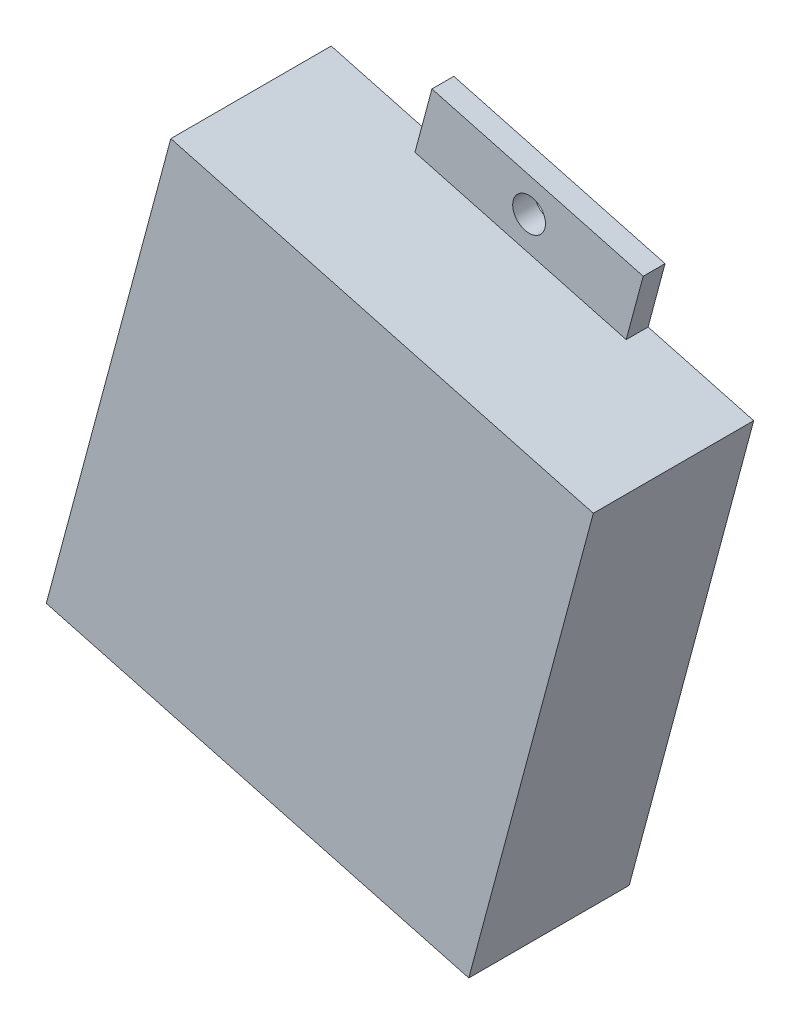
ISO-10303-21;
HEADER;
FILE_DESCRIPTION(('STEP AP214'),'2;1');
FILE_NAME('part.step','',(''),(''),'','','');
FILE_SCHEMA(('AUTOMOTIVE_DESIGN { 1 0 10303 214 1 1 1 1 }'));
ENDSEC;
DATA;
#1=APPLICATION_CONTEXT('core data for automotive mechanical design processes');
#2=APPLICATION_PROTOCOL_DEFINITION('international standard','automotive_design',2000,#1);
#3=PRODUCT_CONTEXT('',#1,'mechanical');
#4=PRODUCT('Part','Part','',(#3));
#5=PRODUCT_RELATED_PRODUCT_CATEGORY('part','',(#4));
#6=PRODUCT_DEFINITION_FORMATION('','',#4);
#7=PRODUCT_DEFINITION_CONTEXT('part definition',#1,'design');
#8=PRODUCT_DEFINITION('design','',#6,#7);
#9=PRODUCT_DEFINITION_SHAPE('','',#8);
#10=(LENGTH_UNIT() NAMED_UNIT(*) SI_UNIT(.MILLI.,.METRE.));
#11=(NAMED_UNIT(*) PLANE_ANGLE_UNIT() SI_UNIT($,.RADIAN.));
#12=(NAMED_UNIT(*) SI_UNIT($,.STERADIAN.) SOLID_ANGLE_UNIT());
#13=UNCERTAINTY_MEASURE_WITH_UNIT(LENGTH_MEASURE(1.E-05),#10,'distance_accuracy_value','');
#14=(GEOMETRIC_REPRESENTATION_CONTEXT(3) GLOBAL_UNCERTAINTY_ASSIGNED_CONTEXT((#13)) GLOBAL_UNIT_ASSIGNED_CONTEXT((#10,
#11,#12)) REPRESENTATION_CONTEXT('',''));
#15=CARTESIAN_POINT('',(0.,0.,0.));
#16=DIRECTION('',(0.,0.,1.));
#17=DIRECTION('',(1.,0.,0.));
#18=AXIS2_PLACEMENT_3D('',#15,#16,#17);
#19=CARTESIAN_POINT('',(31.705714191345,-147.7777815141,107.3));
#20=DIRECTION('',(0.,0.,1.));
#21=DIRECTION('',(0.258819045102985,0.965925826288944,0.));
#22=AXIS2_PLACEMENT_3D('',#19,#20,#21);
#23=CYLINDRICAL_SURFACE('',#22,2.25);
#24=DIRECTION('',(0.,0.,1.));
#25=VECTOR('',#24,1.);
#26=CARTESIAN_POINT('',(32.288057042825,-145.604448405,107.3));
#27=LINE('',#26,#25);
#28=CARTESIAN_POINT('',(32.288057042825,-145.604448405,107.5));
#29=VERTEX_POINT('',#28);
#30=CARTESIAN_POINT('',(32.288057042825,-145.604448405,110.5));
#31=VERTEX_POINT('',#30);
#32=EDGE_CURVE('E10',#29,#31,#27,.T.);
#33=ORIENTED_EDGE('',*,*,#32,.F.);
#34=CARTESIAN_POINT('',(31.705714191345,-147.7777815141,107.5));
#35=DIRECTION('',(0.,0.,1.));
#36=DIRECTION('',(0.258819045102985,0.965925826288944,0.));
#37=AXIS2_PLACEMENT_3D('',#34,#35,#36);
#38=CIRCLE('',#37,2.25);
#39=EDGE_CURVE('E167',#29,#29,#38,.T.);
#40=ORIENTED_EDGE('',*,*,#39,.F.);
#41=ORIENTED_EDGE('',*,*,#32,.T.);
#42=CARTESIAN_POINT('',(31.705714191345,-147.7777815141,110.5));
#43=DIRECTION('',(0.,0.,1.));
#44=DIRECTION('',(0.258819045102985,0.965925826288944,0.));
#45=AXIS2_PLACEMENT_3D('',#42,#43,#44);
#46=CIRCLE('',#45,2.25);
#47=EDGE_CURVE('E208',#31,#31,#46,.T.);
#48=ORIENTED_EDGE('',*,*,#47,.T.);
#49=EDGE_LOOP('',(#33,#40,#41,#48));
#50=FACE_BOUND('',#49,.T.);
#51=ADVANCED_FACE('F15',(#50),#23,.F.);
#52=CARTESIAN_POINT('',(47.359287288642,-147.3134009723,107.5));
#53=DIRECTION('',(0.258819045102985,0.965925826288944,0.));
#54=DIRECTION('',(0.,0.,-1.));
#55=AXIS2_PLACEMENT_3D('',#52,#53,#54);
#56=PLANE('',#55);
#57=DIRECTION('',(0.,0.,1.));
#58=VECTOR('',#57,1.);
#59=CARTESIAN_POINT('',(47.359287288642,-147.3134009723,107.5));
#60=LINE('',#59,#58);
#61=CARTESIAN_POINT('',(47.359287288642,-147.3134009723,107.5));
#62=VERTEX_POINT('',#61);
#63=CARTESIAN_POINT('',(47.359287288642,-147.3134009723,110.5));
#64=VERTEX_POINT('',#63);
#65=EDGE_CURVE('E26',#62,#64,#60,.T.);
#66=ORIENTED_EDGE('',*,*,#65,.F.);
#67=DIRECTION('',(-0.965925826288944,0.258819045102985,0.));
#68=VECTOR('',#67,1.);
#69=CARTESIAN_POINT('',(47.359287288642,-147.3134009723,107.5));
#70=LINE('',#69,#68);
#71=CARTESIAN_POINT('',(18.38151249997,-139.5488296193,107.5));
#72=VERTEX_POINT('',#71);
#73=EDGE_CURVE('E218',#62,#72,#70,.T.);
#74=ORIENTED_EDGE('',*,*,#73,.T.);
#75=DIRECTION('',(0.,0.,1.));
#76=VECTOR('',#75,1.);
#77=CARTESIAN_POINT('',(18.38151249997,-139.5488296193,107.5));
#78=LINE('',#77,#76);
#79=CARTESIAN_POINT('',(18.38151249997,-139.5488296193,110.5));
#80=VERTEX_POINT('',#79);
#81=EDGE_CURVE('E254',#72,#80,#78,.T.);
#82=ORIENTED_EDGE('',*,*,#81,.T.);
#83=DIRECTION('',(-0.965925826288944,0.258819045102985,0.));
#84=VECTOR('',#83,1.);
#85=CARTESIAN_POINT('',(47.359287288642,-147.3134009723,110.5));
#86=LINE('',#85,#84);
#87=EDGE_CURVE('E205',#64,#80,#86,.T.);
#88=ORIENTED_EDGE('',*,*,#87,.F.);
#89=EDGE_LOOP('',(#66,#74,#82,#88));
#90=FACE_BOUND('',#89,.T.);
#91=ADVANCED_FACE('F320',(#90),#56,.T.);
#92=CARTESIAN_POINT('',(45.029915882719,-156.0067334089,107.5));
#93=DIRECTION('',(-0.965925826288944,0.258819045102985,0.));
#94=DIRECTION('',(0.,0.,1.));
#95=AXIS2_PLACEMENT_3D('',#92,#93,#94);
#96=PLANE('',#95);
#97=ORIENTED_EDGE('',*,*,#65,.T.);
#98=DIRECTION('',(0.258819045102985,0.965925826288944,0.));
#99=VECTOR('',#98,1.);
#100=CARTESIAN_POINT('',(45.029915882719,-156.0067334089,110.5));
#101=LINE('',#100,#99);
#102=CARTESIAN_POINT('',(45.029915882719,-156.0067334089,110.5));
#103=VERTEX_POINT('',#102);
#104=EDGE_CURVE('E209',#103,#64,#101,.T.);
#105=ORIENTED_EDGE('',*,*,#104,.F.);
#106=DIRECTION('',(0.,0.,1.));
#107=VECTOR('',#106,1.);
#108=CARTESIAN_POINT('',(45.029915882719,-156.0067334089,107.5));
#109=LINE('',#108,#107);
#110=CARTESIAN_POINT('',(45.029915882719,-156.0067334089,107.5));
#111=VERTEX_POINT('',#110);
#112=EDGE_CURVE('E223',#111,#103,#109,.T.);
#113=ORIENTED_EDGE('',*,*,#112,.F.);
#114=DIRECTION('',(0.258819045102985,0.965925826288944,0.));
#115=VECTOR('',#114,1.);
#116=CARTESIAN_POINT('',(45.029915882719,-156.0067334089,107.5));
#117=LINE('',#116,#115);
#118=EDGE_CURVE('E181',#111,#62,#117,.T.);
#119=ORIENTED_EDGE('',*,*,#118,.T.);
#120=EDGE_LOOP('',(#97,#105,#113,#119));
#121=FACE_BOUND('',#120,.T.);
#122=ADVANCED_FACE('F328',(#121),#96,.F.);
#123=CARTESIAN_POINT('',(45.029915882719,-156.0067334089,110.5));
#124=DIRECTION('',(0.,0.,1.));
#125=DIRECTION('',(1.,0.,0.));
#126=AXIS2_PLACEMENT_3D('',#123,#124,#125);
#127=PLANE('',#126);
#128=ORIENTED_EDGE('',*,*,#47,.F.);
#129=EDGE_LOOP('',(#128));
#130=FACE_BOUND('',#129,.T.);
#131=DIRECTION('',(-0.965925826288944,0.258819045102985,0.));
#132=VECTOR('',#131,1.);
#133=CARTESIAN_POINT('',(45.029915882719,-156.0067334089,110.5));
#134=LINE('',#133,#132);
#135=CARTESIAN_POINT('',(16.052141094047,-148.2421620559,110.5));
#136=VERTEX_POINT('',#135);
#137=EDGE_CURVE('E201',#103,#136,#134,.T.);
#138=ORIENTED_EDGE('',*,*,#137,.F.);
#139=ORIENTED_EDGE('',*,*,#104,.T.);
#140=ORIENTED_EDGE('',*,*,#87,.T.);
#141=DIRECTION('',(0.258819045102985,0.965925826288944,0.));
#142=VECTOR('',#141,1.);
#143=CARTESIAN_POINT('',(16.052141094047,-148.2421620559,110.5));
#144=LINE('',#143,#142);
#145=EDGE_CURVE('E161',#136,#80,#144,.T.);
#146=ORIENTED_EDGE('',*,*,#145,.F.);
#147=EDGE_LOOP('',(#138,#139,#140,#146));
#148=FACE_BOUND('',#147,.T.);
#149=ADVANCED_FACE('F17',(#130,#148),#127,.T.);
#150=CARTESIAN_POINT('',(16.052141094047,-148.2421620559,107.5));
#151=DIRECTION('',(-0.965925826288944,0.258819045102985,0.));
#152=DIRECTION('',(0.,0.,1.));
#153=AXIS2_PLACEMENT_3D('',#150,#151,#152);
#154=PLANE('',#153);
#155=DIRECTION('',(0.258819045102985,0.965925826288944,0.));
#156=VECTOR('',#155,1.);
#157=CARTESIAN_POINT('',(16.052141094047,-148.2421620559,107.5));
#158=LINE('',#157,#156);
#159=CARTESIAN_POINT('',(16.052141094047,-148.2421620559,107.5));
#160=VERTEX_POINT('',#159);
#161=EDGE_CURVE('E214',#160,#72,#158,.T.);
#162=ORIENTED_EDGE('',*,*,#161,.F.);
#163=DIRECTION('',(0.,0.,1.));
#164=VECTOR('',#163,1.);
#165=CARTESIAN_POINT('',(16.052141094047,-148.2421620559,107.5));
#166=LINE('',#165,#164);
#167=EDGE_CURVE('E162',#160,#136,#166,.T.);
#168=ORIENTED_EDGE('',*,*,#167,.T.);
#169=ORIENTED_EDGE('',*,*,#145,.T.);
#170=ORIENTED_EDGE('',*,*,#81,.F.);
#171=EDGE_LOOP('',(#162,#168,#169,#170));
#172=FACE_BOUND('',#171,.T.);
#173=ADVANCED_FACE('F324',(#172),#154,.T.);
#174=CARTESIAN_POINT('',(12.294285808655,-220.2222184858,107.3));
#175=DIRECTION('',(0.,0.,1.));
#176=DIRECTION('',(0.258819045102985,0.965925826288944,0.));
#177=AXIS2_PLACEMENT_3D('',#174,#175,#176);
#178=CYLINDRICAL_SURFACE('',#177,2.25);
#179=DIRECTION('',(0.,0.,1.));
#180=VECTOR('',#179,1.);
#181=CARTESIAN_POINT('',(12.876628660136,-218.0488853766,107.3));
#182=LINE('',#181,#180);
#183=CARTESIAN_POINT('',(12.876628660136,-218.0488853766,107.5));
#184=VERTEX_POINT('',#183);
#185=CARTESIAN_POINT('',(12.876628660136,-218.0488853766,110.5));
#186=VERTEX_POINT('',#185);
#187=EDGE_CURVE('E154',#184,#186,#182,.T.);
#188=ORIENTED_EDGE('',*,*,#187,.F.);
#189=CARTESIAN_POINT('',(12.294285808655,-220.2222184858,107.5));
#190=DIRECTION('',(0.,0.,1.));
#191=DIRECTION('',(0.258819045102985,0.965925826288944,0.));
#192=AXIS2_PLACEMENT_3D('',#189,#190,#191);
#193=CIRCLE('',#192,2.25);
#194=EDGE_CURVE('E157',#184,#184,#193,.T.);
#195=ORIENTED_EDGE('',*,*,#194,.F.);
#196=ORIENTED_EDGE('',*,*,#187,.T.);
#197=CARTESIAN_POINT('',(12.294285808655,-220.2222184858,110.5));
#198=DIRECTION('',(0.,0.,1.));
#199=DIRECTION('',(0.258819045102985,0.965925826288944,0.));
#200=AXIS2_PLACEMENT_3D('',#197,#198,#199);
#201=CIRCLE('',#200,2.25);
#202=EDGE_CURVE('E159',#186,#186,#201,.T.);
#203=ORIENTED_EDGE('',*,*,#202,.T.);
#204=EDGE_LOOP('',(#188,#195,#196,#203));
#205=FACE_BOUND('',#204,.T.);
#206=ADVANCED_FACE('F156',(#205),#178,.F.);
#207=CARTESIAN_POINT('',(25.61848750003,-228.4511703806,107.5));
#208=DIRECTION('',(0.258819045102985,0.965925826288944,0.));
#209=DIRECTION('',(0.,0.,-1.));
#210=AXIS2_PLACEMENT_3D('',#207,#208,#209);
#211=PLANE('',#210);
#212=DIRECTION('',(-0.965925826288944,0.258819045102985,0.));
#213=VECTOR('',#212,1.);
#214=CARTESIAN_POINT('',(25.61848750003,-228.4511703806,110.5));
#215=LINE('',#214,#213);
#216=CARTESIAN_POINT('',(25.61848750003,-228.4511703806,110.5));
#217=VERTEX_POINT('',#216);
#218=CARTESIAN_POINT('',(-3.359287288642,-220.6865990276,110.5));
#219=VERTEX_POINT('',#218);
#220=EDGE_CURVE('E204',#217,#219,#215,.T.);
#221=ORIENTED_EDGE('',*,*,#220,.T.);
#222=DIRECTION('',(0.,0.,1.));
#223=VECTOR('',#222,1.);
#224=CARTESIAN_POINT('',(-3.359287288642,-220.6865990276,107.5));
#225=LINE('',#224,#223);
#226=CARTESIAN_POINT('',(-3.359287288642,-220.6865990276,107.5));
#227=VERTEX_POINT('',#226);
#228=EDGE_CURVE('E174',#227,#219,#225,.T.);
#229=ORIENTED_EDGE('',*,*,#228,.F.);
#230=DIRECTION('',(-0.965925826288944,0.258819045102985,0.));
#231=VECTOR('',#230,1.);
#232=CARTESIAN_POINT('',(25.61848750003,-228.4511703806,107.5));
#233=LINE('',#232,#231);
#234=CARTESIAN_POINT('',(25.61848750003,-228.4511703806,107.5));
#235=VERTEX_POINT('',#234);
#236=EDGE_CURVE('E278',#235,#227,#233,.T.);
#237=ORIENTED_EDGE('',*,*,#236,.F.);
#238=DIRECTION('',(0.,0.,1.));
#239=VECTOR('',#238,1.);
#240=CARTESIAN_POINT('',(25.61848750003,-228.4511703806,107.5));
#241=LINE('',#240,#239);
#242=EDGE_CURVE('E196',#235,#217,#241,.T.);
#243=ORIENTED_EDGE('',*,*,#242,.T.);
#244=EDGE_LOOP('',(#221,#229,#237,#243));
#245=FACE_BOUND('',#244,.T.);
#246=ADVANCED_FACE('F302',(#245),#211,.F.);
#247=CARTESIAN_POINT('',(59.518803277055,-159.8890190855,107.5));
#248=DIRECTION('',(0.258819045102985,0.965925826288944,0.));
#249=DIRECTION('',(0.,0.,-1.));
#250=AXIS2_PLACEMENT_3D('',#247,#248,#249);
#251=PLANE('',#250);
#252=DIRECTION('',(-0.965925826288944,0.258819045102985,0.));
#253=VECTOR('',#252,1.);
#254=CARTESIAN_POINT('',(59.518803277055,-159.8890190855,129.5));
#255=LINE('',#254,#253);
#256=CARTESIAN_POINT('',(59.518803277055,-159.8890190855,129.5));
#257=VERTEX_POINT('',#256);
#258=CARTESIAN_POINT('',(1.563253699711,-144.3598763793,129.5));
#259=VERTEX_POINT('',#258);
#260=EDGE_CURVE('E187',#257,#259,#255,.T.);
#261=ORIENTED_EDGE('',*,*,#260,.F.);
#262=DIRECTION('',(0.,0.,1.));
#263=VECTOR('',#262,1.);
#264=CARTESIAN_POINT('',(59.518803277055,-159.8890190855,107.5));
#265=LINE('',#264,#263);
#266=CARTESIAN_POINT('',(59.518803277055,-159.8890190855,107.5));
#267=VERTEX_POINT('',#266);
#268=EDGE_CURVE('E227',#267,#257,#265,.T.);
#269=ORIENTED_EDGE('',*,*,#268,.F.);
#270=DIRECTION('',(-0.965925826288944,0.258819045102985,0.));
#271=VECTOR('',#270,1.);
#272=CARTESIAN_POINT('',(59.518803277055,-159.8890190855,107.5));
#273=LINE('',#272,#271);
#274=EDGE_CURVE('E177',#267,#111,#273,.T.);
#275=ORIENTED_EDGE('',*,*,#274,.T.);
#276=ORIENTED_EDGE('',*,*,#112,.T.);
#277=ORIENTED_EDGE('',*,*,#137,.T.);
#278=ORIENTED_EDGE('',*,*,#167,.F.);
#279=DIRECTION('',(-0.965925826288944,0.258819045102985,0.));
#280=VECTOR('',#279,1.);
#281=CARTESIAN_POINT('',(59.518803277055,-159.8890190855,107.5));
#282=LINE('',#281,#280);
#283=CARTESIAN_POINT('',(1.563253699711,-144.3598763793,107.5));
#284=VERTEX_POINT('',#283);
#285=EDGE_CURVE('E219',#160,#284,#282,.T.);
#286=ORIENTED_EDGE('',*,*,#285,.T.);
#287=DIRECTION('',(0.,0.,1.));
#288=VECTOR('',#287,1.);
#289=CARTESIAN_POINT('',(1.563253699711,-144.3598763793,107.5));
#290=LINE('',#289,#288);
#291=EDGE_CURVE('E19',#284,#259,#290,.T.);
#292=ORIENTED_EDGE('',*,*,#291,.T.);
#293=EDGE_LOOP('',(#261,#269,#275,#276,#277,#278,#286,#292));
#294=FACE_BOUND('',#293,.T.);
#295=ADVANCED_FACE('F335',(#294),#251,.T.);
#296=CARTESIAN_POINT('',(42.436746300289,-223.6401236206,107.5));
#297=DIRECTION('',(-0.965925826288944,0.258819045102985,0.));
#298=DIRECTION('',(0.,0.,1.));
#299=AXIS2_PLACEMENT_3D('',#296,#297,#298);
#300=PLANE('',#299);
#301=ORIENTED_EDGE('',*,*,#268,.T.);
#302=DIRECTION('',(0.258819045102985,0.965925826288944,0.));
#303=VECTOR('',#302,1.);
#304=CARTESIAN_POINT('',(42.436746300289,-223.6401236206,129.5));
#305=LINE('',#304,#303);
#306=CARTESIAN_POINT('',(42.436746300289,-223.6401236206,129.5));
#307=VERTEX_POINT('',#306);
#308=EDGE_CURVE('E80',#307,#257,#305,.T.);
#309=ORIENTED_EDGE('',*,*,#308,.F.);
#310=DIRECTION('',(0.,0.,1.));
#311=VECTOR('',#310,1.);
#312=CARTESIAN_POINT('',(42.436746300289,-223.6401236206,107.5));
#313=LINE('',#312,#311);
#314=CARTESIAN_POINT('',(42.436746300289,-223.6401236206,107.5));
#315=VERTEX_POINT('',#314);
#316=EDGE_CURVE('E264',#315,#307,#313,.T.);
#317=ORIENTED_EDGE('',*,*,#316,.F.);
#318=DIRECTION('',(0.258819045102985,0.965925826288944,0.));
#319=VECTOR('',#318,1.);
#320=CARTESIAN_POINT('',(42.436746300289,-223.6401236206,107.5));
#321=LINE('',#320,#319);
#322=EDGE_CURVE('E91',#315,#267,#321,.T.);
#323=ORIENTED_EDGE('',*,*,#322,.T.);
#324=EDGE_LOOP('',(#301,#309,#317,#323));
#325=FACE_BOUND('',#324,.T.);
#326=ADVANCED_FACE('F372',(#325),#300,.F.);
#327=CARTESIAN_POINT('',(25.61848750003,-228.4511703806,107.5));
#328=DIRECTION('',(-0.965925826288944,0.258819045102985,0.));
#329=DIRECTION('',(0.,0.,1.));
#330=AXIS2_PLACEMENT_3D('',#327,#328,#329);
#331=PLANE('',#330);
#332=DIRECTION('',(0.,0.,1.));
#333=VECTOR('',#332,1.);
#334=CARTESIAN_POINT('',(27.947858905953,-219.757837944,107.5));
#335=LINE('',#334,#333);
#336=CARTESIAN_POINT('',(27.947858905953,-219.757837944,107.5));
#337=VERTEX_POINT('',#336);
#338=CARTESIAN_POINT('',(27.947858905953,-219.757837944,110.5));
#339=VERTEX_POINT('',#338);
#340=EDGE_CURVE('E233',#337,#339,#335,.T.);
#341=ORIENTED_EDGE('',*,*,#340,.T.);
#342=DIRECTION('',(0.258819045102985,0.965925826288944,0.));
#343=VECTOR('',#342,1.);
#344=CARTESIAN_POINT('',(25.61848750003,-228.4511703806,110.5));
#345=LINE('',#344,#343);
#346=EDGE_CURVE('E197',#217,#339,#345,.T.);
#347=ORIENTED_EDGE('',*,*,#346,.F.);
#348=ORIENTED_EDGE('',*,*,#242,.F.);
#349=DIRECTION('',(0.258819045102985,0.965925826288944,0.));
#350=VECTOR('',#349,1.);
#351=CARTESIAN_POINT('',(25.61848750003,-228.4511703806,107.5));
#352=LINE('',#351,#350);
#353=EDGE_CURVE('E276',#235,#337,#352,.T.);
#354=ORIENTED_EDGE('',*,*,#353,.T.);
#355=EDGE_LOOP('',(#341,#347,#348,#354));
#356=FACE_BOUND('',#355,.T.);
#357=ADVANCED_FACE('F297',(#356),#331,.F.);
#358=CARTESIAN_POINT('',(25.61848750003,-228.4511703806,110.5));
#359=DIRECTION('',(0.,0.,1.));
#360=DIRECTION('',(1.,0.,0.));
#361=AXIS2_PLACEMENT_3D('',#358,#359,#360);
#362=PLANE('',#361);
#363=ORIENTED_EDGE('',*,*,#202,.F.);
#364=EDGE_LOOP('',(#363));
#365=FACE_BOUND('',#364,.T.);
#366=ORIENTED_EDGE('',*,*,#220,.F.);
#367=ORIENTED_EDGE('',*,*,#346,.T.);
#368=DIRECTION('',(-0.965925826288944,0.258819045102985,0.));
#369=VECTOR('',#368,1.);
#370=CARTESIAN_POINT('',(27.947858905953,-219.757837944,110.5));
#371=LINE('',#370,#369);
#372=CARTESIAN_POINT('',(-1.029915882719,-211.993266591,110.5));
#373=VERTEX_POINT('',#372);
#374=EDGE_CURVE('E238',#339,#373,#371,.T.);
#375=ORIENTED_EDGE('',*,*,#374,.T.);
#376=DIRECTION('',(0.258819045102985,0.965925826288944,0.));
#377=VECTOR('',#376,1.);
#378=CARTESIAN_POINT('',(-3.359287288642,-220.6865990276,110.5));
#379=LINE('',#378,#377);
#380=EDGE_CURVE('E222',#219,#373,#379,.T.);
#381=ORIENTED_EDGE('',*,*,#380,.F.);
#382=EDGE_LOOP('',(#366,#367,#375,#381));
#383=FACE_BOUND('',#382,.T.);
#384=ADVANCED_FACE('F371',(#365,#383),#362,.T.);
#385=CARTESIAN_POINT('',(-3.359287288642,-220.6865990276,107.5));
#386=DIRECTION('',(-0.965925826288944,0.258819045102985,0.));
#387=DIRECTION('',(0.,0.,1.));
#388=AXIS2_PLACEMENT_3D('',#385,#386,#387);
#389=PLANE('',#388);
#390=DIRECTION('',(0.258819045102985,0.965925826288944,0.));
#391=VECTOR('',#390,1.);
#392=CARTESIAN_POINT('',(-3.359287288642,-220.6865990276,107.5));
#393=LINE('',#392,#391);
#394=CARTESIAN_POINT('',(-1.029915882719,-211.993266591,107.5));
#395=VERTEX_POINT('',#394);
#396=EDGE_CURVE('E270',#227,#395,#393,.T.);
#397=ORIENTED_EDGE('',*,*,#396,.F.);
#398=ORIENTED_EDGE('',*,*,#228,.T.);
#399=ORIENTED_EDGE('',*,*,#380,.T.);
#400=DIRECTION('',(0.,0.,1.));
#401=VECTOR('',#400,1.);
#402=CARTESIAN_POINT('',(-1.029915882719,-211.993266591,107.5));
#403=LINE('',#402,#401);
#404=EDGE_CURVE('E191',#395,#373,#403,.T.);
#405=ORIENTED_EDGE('',*,*,#404,.F.);
#406=EDGE_LOOP('',(#397,#398,#399,#405));
#407=FACE_BOUND('',#406,.T.);
#408=ADVANCED_FACE('F394',(#407),#389,.T.);
#409=CARTESIAN_POINT('',(42.436746300289,-223.6401236206,107.5));
#410=DIRECTION('',(0.,0.,1.));
#411=DIRECTION('',(1.,0.,0.));
#412=AXIS2_PLACEMENT_3D('',#409,#410,#411);
#413=PLANE('',#412);
#414=ORIENTED_EDGE('',*,*,#39,.T.);
#415=EDGE_LOOP('',(#414));
#416=FACE_BOUND('',#415,.T.);
#417=ORIENTED_EDGE('',*,*,#194,.T.);
#418=EDGE_LOOP('',(#417));
#419=FACE_BOUND('',#418,.T.);
#420=ORIENTED_EDGE('',*,*,#353,.F.);
#421=ORIENTED_EDGE('',*,*,#236,.T.);
#422=ORIENTED_EDGE('',*,*,#396,.T.);
#423=DIRECTION('',(-0.965925826288944,0.258819045102985,0.));
#424=VECTOR('',#423,1.);
#425=CARTESIAN_POINT('',(42.436746300289,-223.6401236206,107.5));
#426=LINE('',#425,#424);
#427=CARTESIAN_POINT('',(-15.51880327705,-208.1109809144,107.5));
#428=VERTEX_POINT('',#427);
#429=EDGE_CURVE('E188',#395,#428,#426,.T.);
#430=ORIENTED_EDGE('',*,*,#429,.T.);
#431=DIRECTION('',(0.258819045102985,0.965925826288944,0.));
#432=VECTOR('',#431,1.);
#433=CARTESIAN_POINT('',(-15.51880327705,-208.1109809144,107.5));
#434=LINE('',#433,#432);
#435=EDGE_CURVE('E186',#428,#284,#434,.T.);
#436=ORIENTED_EDGE('',*,*,#435,.T.);
#437=ORIENTED_EDGE('',*,*,#285,.F.);
#438=ORIENTED_EDGE('',*,*,#161,.T.);
#439=ORIENTED_EDGE('',*,*,#73,.F.);
#440=ORIENTED_EDGE('',*,*,#118,.F.);
#441=ORIENTED_EDGE('',*,*,#274,.F.);
#442=ORIENTED_EDGE('',*,*,#322,.F.);
#443=DIRECTION('',(-0.965925826288944,0.258819045102985,0.));
#444=VECTOR('',#443,1.);
#445=CARTESIAN_POINT('',(42.436746300289,-223.6401236206,107.5));
#446=LINE('',#445,#444);
#447=EDGE_CURVE('E237',#315,#337,#446,.T.);
#448=ORIENTED_EDGE('',*,*,#447,.T.);
#449=EDGE_LOOP('',(#420,#421,#422,#430,#436,#437,#438,#439,#440,#441,#442,#448));
#450=FACE_BOUND('',#449,.T.);
#451=ADVANCED_FACE('F165',(#416,#419,#450),#413,.F.);
#452=CARTESIAN_POINT('',(-15.51880327705,-208.1109809144,107.5));
#453=DIRECTION('',(-0.965925826288944,0.258819045102985,0.));
#454=DIRECTION('',(0.,0.,1.));
#455=AXIS2_PLACEMENT_3D('',#452,#453,#454);
#456=PLANE('',#455);
#457=ORIENTED_EDGE('',*,*,#435,.F.);
#458=DIRECTION('',(0.,0.,1.));
#459=VECTOR('',#458,1.);
#460=CARTESIAN_POINT('',(-15.51880327705,-208.1109809144,107.5));
#461=LINE('',#460,#459);
#462=CARTESIAN_POINT('',(-15.51880327705,-208.1109809144,129.5));
#463=VERTEX_POINT('',#462);
#464=EDGE_CURVE('E192',#428,#463,#461,.T.);
#465=ORIENTED_EDGE('',*,*,#464,.T.);
#466=DIRECTION('',(0.258819045102985,0.965925826288944,0.));
#467=VECTOR('',#466,1.);
#468=CARTESIAN_POINT('',(-15.51880327705,-208.1109809144,129.5));
#469=LINE('',#468,#467);
#470=EDGE_CURVE('E183',#463,#259,#469,.T.);
#471=ORIENTED_EDGE('',*,*,#470,.T.);
#472=ORIENTED_EDGE('',*,*,#291,.F.);
#473=EDGE_LOOP('',(#457,#465,#471,#472));
#474=FACE_BOUND('',#473,.T.);
#475=ADVANCED_FACE('F337',(#474),#456,.T.);
#476=CARTESIAN_POINT('',(42.436746300289,-223.6401236206,129.5));
#477=DIRECTION('',(0.,0.,1.));
#478=DIRECTION('',(1.,0.,0.));
#479=AXIS2_PLACEMENT_3D('',#476,#477,#478);
#480=PLANE('',#479);
#481=DIRECTION('',(-0.965925826288944,0.258819045102985,0.));
#482=VECTOR('',#481,1.);
#483=CARTESIAN_POINT('',(42.436746300289,-223.6401236206,129.5));
#484=LINE('',#483,#482);
#485=EDGE_CURVE('E244',#307,#463,#484,.T.);
#486=ORIENTED_EDGE('',*,*,#485,.F.);
#487=ORIENTED_EDGE('',*,*,#308,.T.);
#488=ORIENTED_EDGE('',*,*,#260,.T.);
#489=ORIENTED_EDGE('',*,*,#470,.F.);
#490=EDGE_LOOP('',(#486,#487,#488,#489));
#491=FACE_BOUND('',#490,.T.);
#492=ADVANCED_FACE('F348',(#491),#480,.T.);
#493=CARTESIAN_POINT('',(42.436746300289,-223.6401236206,107.5));
#494=DIRECTION('',(0.258819045102985,0.965925826288944,0.));
#495=DIRECTION('',(0.,0.,-1.));
#496=AXIS2_PLACEMENT_3D('',#493,#494,#495);
#497=PLANE('',#496);
#498=ORIENTED_EDGE('',*,*,#464,.F.);
#499=ORIENTED_EDGE('',*,*,#429,.F.);
#500=ORIENTED_EDGE('',*,*,#404,.T.);
#501=ORIENTED_EDGE('',*,*,#374,.F.);
#502=ORIENTED_EDGE('',*,*,#340,.F.);
#503=ORIENTED_EDGE('',*,*,#447,.F.);
#504=ORIENTED_EDGE('',*,*,#316,.T.);
#505=ORIENTED_EDGE('',*,*,#485,.T.);
#506=EDGE_LOOP('',(#498,#499,#500,#501,#502,#503,#504,#505));
#507=FACE_BOUND('',#506,.T.);
#508=ADVANCED_FACE('F294',(#507),#497,.F.);
#509=CLOSED_SHELL('',(#51,#91,#122,#149,#173,#206,#246,#295,#326,#357,#384,#408,#451,#475,#492,#508));
#510=MANIFOLD_SOLID_BREP('B1',#509);
#511=ADVANCED_BREP_SHAPE_REPRESENTATION('',(#18,#510),#14);
#512=SHAPE_DEFINITION_REPRESENTATION(#9,#511);
ENDSEC;
END-ISO-10303-21;
